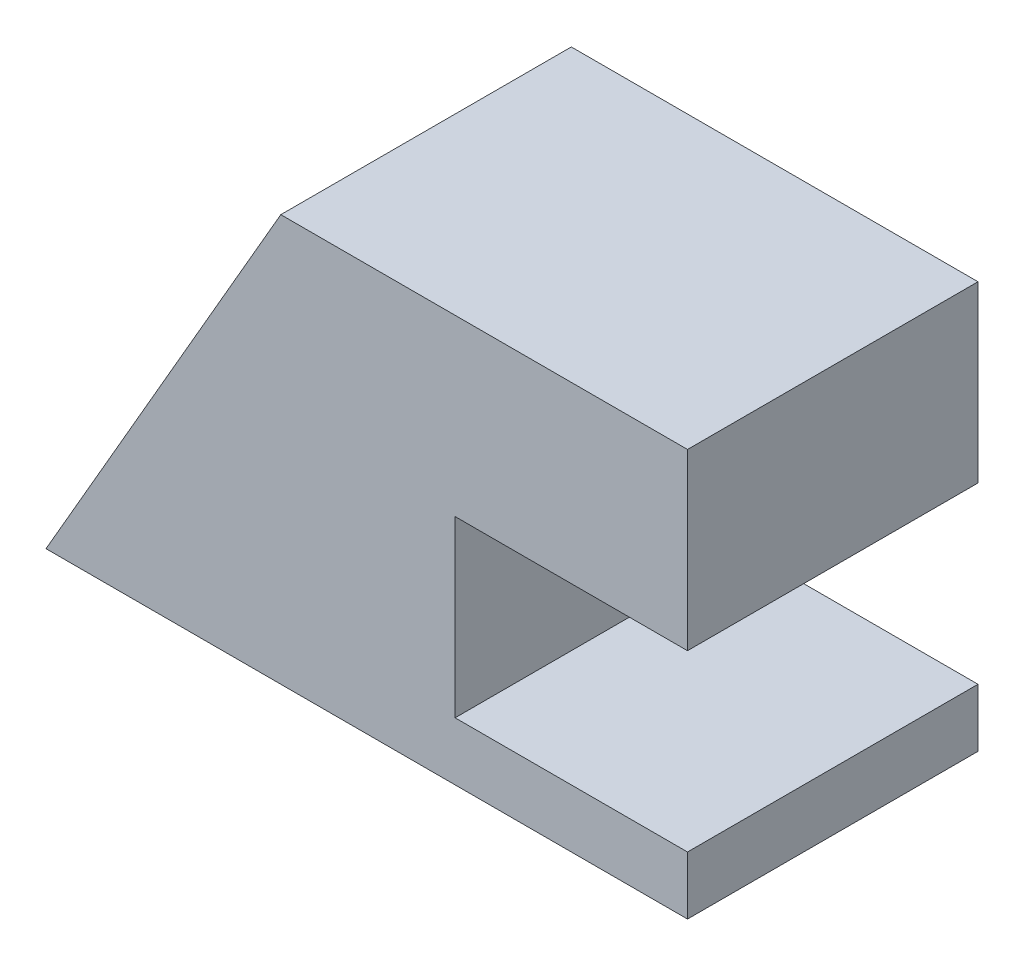
ISO-10303-21;
HEADER;
FILE_DESCRIPTION(('STEP AP214'),'2;1');
FILE_NAME('part.step','',(''),(''),'','','');
FILE_SCHEMA(('AUTOMOTIVE_DESIGN { 1 0 10303 214 1 1 1 1 }'));
ENDSEC;
DATA;
#1=APPLICATION_CONTEXT('core data for automotive mechanical design processes');
#2=APPLICATION_PROTOCOL_DEFINITION('international standard','automotive_design',2000,#1);
#3=PRODUCT_CONTEXT('',#1,'mechanical');
#4=PRODUCT('Part','Part','',(#3));
#5=PRODUCT_RELATED_PRODUCT_CATEGORY('part','',(#4));
#6=PRODUCT_DEFINITION_FORMATION('','',#4);
#7=PRODUCT_DEFINITION_CONTEXT('part definition',#1,'design');
#8=PRODUCT_DEFINITION('design','',#6,#7);
#9=PRODUCT_DEFINITION_SHAPE('','',#8);
#10=(LENGTH_UNIT() NAMED_UNIT(*) SI_UNIT(.MILLI.,.METRE.));
#11=(NAMED_UNIT(*) PLANE_ANGLE_UNIT() SI_UNIT($,.RADIAN.));
#12=(NAMED_UNIT(*) SI_UNIT($,.STERADIAN.) SOLID_ANGLE_UNIT());
#13=UNCERTAINTY_MEASURE_WITH_UNIT(LENGTH_MEASURE(1.E-05),#10,'distance_accuracy_value','');
#14=(GEOMETRIC_REPRESENTATION_CONTEXT(3) GLOBAL_UNCERTAINTY_ASSIGNED_CONTEXT((#13)) GLOBAL_UNIT_ASSIGNED_CONTEXT((#10,
#11,#12)) REPRESENTATION_CONTEXT('',''));
#15=CARTESIAN_POINT('',(0.,0.,0.));
#16=DIRECTION('',(0.,0.,1.));
#17=DIRECTION('',(1.,0.,0.));
#18=AXIS2_PLACEMENT_3D('',#15,#16,#17);
#19=CARTESIAN_POINT('',(11.0414518843274,4.,5.));
#20=DIRECTION('',(-1.,0.,0.));
#21=DIRECTION('',(0.,0.,1.));
#22=AXIS2_PLACEMENT_3D('',#19,#20,#21);
#23=PLANE('',#22);
#24=DIRECTION('',(0.,1.,0.));
#25=VECTOR('',#24,1.);
#26=CARTESIAN_POINT('',(11.0414518843274,4.,0.));
#27=LINE('',#26,#25);
#28=CARTESIAN_POINT('',(11.0414518843274,4.,0.));
#29=VERTEX_POINT('',#28);
#30=CARTESIAN_POINT('',(11.0414518843274,7.,0.));
#31=VERTEX_POINT('',#30);
#32=EDGE_CURVE('E145',#29,#31,#27,.T.);
#33=ORIENTED_EDGE('',*,*,#32,.T.);
#34=DIRECTION('',(0.,0.,-1.));
#35=VECTOR('',#34,1.);
#36=CARTESIAN_POINT('',(11.0414518843274,7.,5.));
#37=LINE('',#36,#35);
#38=CARTESIAN_POINT('',(11.0414518843274,7.,5.));
#39=VERTEX_POINT('',#38);
#40=EDGE_CURVE('E11',#39,#31,#37,.T.);
#41=ORIENTED_EDGE('',*,*,#40,.F.);
#42=DIRECTION('',(0.,1.,0.));
#43=VECTOR('',#42,1.);
#44=CARTESIAN_POINT('',(11.0414518843274,4.,5.));
#45=LINE('',#44,#43);
#46=CARTESIAN_POINT('',(11.0414518843274,4.,5.));
#47=VERTEX_POINT('',#46);
#48=EDGE_CURVE('E167',#47,#39,#45,.T.);
#49=ORIENTED_EDGE('',*,*,#48,.F.);
#50=DIRECTION('',(0.,0.,-1.));
#51=VECTOR('',#50,1.);
#52=CARTESIAN_POINT('',(11.0414518843274,4.,5.));
#53=LINE('',#52,#51);
#54=EDGE_CURVE('E141',#47,#29,#53,.T.);
#55=ORIENTED_EDGE('',*,*,#54,.T.);
#56=EDGE_LOOP('',(#33,#41,#49,#55));
#57=FACE_BOUND('',#56,.T.);
#58=ADVANCED_FACE('F44',(#57),#23,.F.);
#59=CARTESIAN_POINT('',(11.0414518843274,7.,5.));
#60=DIRECTION('',(0.,-1.,0.));
#61=DIRECTION('',(0.,0.,-1.));
#62=AXIS2_PLACEMENT_3D('',#59,#60,#61);
#63=PLANE('',#62);
#64=DIRECTION('',(-1.,0.,0.));
#65=VECTOR('',#64,1.);
#66=CARTESIAN_POINT('',(11.0414518843274,7.,0.));
#67=LINE('',#66,#65);
#68=CARTESIAN_POINT('',(4.04145188432742,7.,0.));
#69=VERTEX_POINT('',#68);
#70=EDGE_CURVE('E149',#31,#69,#67,.T.);
#71=ORIENTED_EDGE('',*,*,#70,.T.);
#72=DIRECTION('',(0.,0.,-1.));
#73=VECTOR('',#72,1.);
#74=CARTESIAN_POINT('',(4.04145188432742,7.,5.));
#75=LINE('',#74,#73);
#76=CARTESIAN_POINT('',(4.04145188432742,7.,5.));
#77=VERTEX_POINT('',#76);
#78=EDGE_CURVE('E53',#77,#69,#75,.T.);
#79=ORIENTED_EDGE('',*,*,#78,.F.);
#80=DIRECTION('',(-1.,0.,0.));
#81=VECTOR('',#80,1.);
#82=CARTESIAN_POINT('',(11.0414518843274,7.,5.));
#83=LINE('',#82,#81);
#84=EDGE_CURVE('E104',#39,#77,#83,.T.);
#85=ORIENTED_EDGE('',*,*,#84,.F.);
#86=ORIENTED_EDGE('',*,*,#40,.T.);
#87=EDGE_LOOP('',(#71,#79,#85,#86));
#88=FACE_BOUND('',#87,.T.);
#89=ADVANCED_FACE('F213',(#88),#63,.F.);
#90=CARTESIAN_POINT('',(4.04145188432742,7.,5.));
#91=DIRECTION('',(0.866025403784436,-0.500000000000004,0.));
#92=DIRECTION('',(0.500000000000004,0.866025403784436,0.));
#93=AXIS2_PLACEMENT_3D('',#90,#91,#92);
#94=PLANE('',#93);
#95=DIRECTION('',(-0.500000000000004,-0.866025403784436,0.));
#96=VECTOR('',#95,1.);
#97=CARTESIAN_POINT('',(4.04145188432742,7.,0.));
#98=LINE('',#97,#96);
#99=CARTESIAN_POINT('',(0.,0.,0.));
#100=VERTEX_POINT('',#99);
#101=EDGE_CURVE('E152',#69,#100,#98,.T.);
#102=ORIENTED_EDGE('',*,*,#101,.T.);
#103=DIRECTION('',(0.,0.,-1.));
#104=VECTOR('',#103,1.);
#105=CARTESIAN_POINT('',(0.,0.,5.));
#106=LINE('',#105,#104);
#107=CARTESIAN_POINT('',(0.,0.,5.));
#108=VERTEX_POINT('',#107);
#109=EDGE_CURVE('E178',#108,#100,#106,.T.);
#110=ORIENTED_EDGE('',*,*,#109,.F.);
#111=DIRECTION('',(-0.500000000000004,-0.866025403784436,0.));
#112=VECTOR('',#111,1.);
#113=CARTESIAN_POINT('',(4.04145188432742,7.,5.));
#114=LINE('',#113,#112);
#115=EDGE_CURVE('E188',#77,#108,#114,.T.);
#116=ORIENTED_EDGE('',*,*,#115,.F.);
#117=ORIENTED_EDGE('',*,*,#78,.T.);
#118=EDGE_LOOP('',(#102,#110,#116,#117));
#119=FACE_BOUND('',#118,.T.);
#120=ADVANCED_FACE('F186',(#119),#94,.F.);
#121=CARTESIAN_POINT('',(0.,0.,5.));
#122=DIRECTION('',(0.,1.,0.));
#123=DIRECTION('',(-1.,0.,0.));
#124=AXIS2_PLACEMENT_3D('',#121,#122,#123);
#125=PLANE('',#124);
#126=DIRECTION('',(1.,0.,0.));
#127=VECTOR('',#126,1.);
#128=CARTESIAN_POINT('',(0.,0.,0.));
#129=LINE('',#128,#127);
#130=CARTESIAN_POINT('',(11.0414518843274,0.,0.));
#131=VERTEX_POINT('',#130);
#132=EDGE_CURVE('E155',#100,#131,#129,.T.);
#133=ORIENTED_EDGE('',*,*,#132,.T.);
#134=DIRECTION('',(0.,0.,-1.));
#135=VECTOR('',#134,1.);
#136=CARTESIAN_POINT('',(11.0414518843274,0.,5.));
#137=LINE('',#136,#135);
#138=CARTESIAN_POINT('',(11.0414518843274,0.,5.));
#139=VERTEX_POINT('',#138);
#140=EDGE_CURVE('E174',#139,#131,#137,.T.);
#141=ORIENTED_EDGE('',*,*,#140,.F.);
#142=DIRECTION('',(1.,0.,0.));
#143=VECTOR('',#142,1.);
#144=CARTESIAN_POINT('',(0.,0.,5.));
#145=LINE('',#144,#143);
#146=EDGE_CURVE('E201',#108,#139,#145,.T.);
#147=ORIENTED_EDGE('',*,*,#146,.F.);
#148=ORIENTED_EDGE('',*,*,#109,.T.);
#149=EDGE_LOOP('',(#133,#141,#147,#148));
#150=FACE_BOUND('',#149,.T.);
#151=ADVANCED_FACE('F196',(#150),#125,.F.);
#152=CARTESIAN_POINT('',(11.0414518843274,0.,5.));
#153=DIRECTION('',(-1.,0.,0.));
#154=DIRECTION('',(0.,0.,1.));
#155=AXIS2_PLACEMENT_3D('',#152,#153,#154);
#156=PLANE('',#155);
#157=DIRECTION('',(0.,1.,0.));
#158=VECTOR('',#157,1.);
#159=CARTESIAN_POINT('',(11.0414518843274,0.,0.));
#160=LINE('',#159,#158);
#161=CARTESIAN_POINT('',(11.0414518843274,1.,0.));
#162=VERTEX_POINT('',#161);
#163=EDGE_CURVE('E158',#131,#162,#160,.T.);
#164=ORIENTED_EDGE('',*,*,#163,.T.);
#165=DIRECTION('',(0.,0.,-1.));
#166=VECTOR('',#165,1.);
#167=CARTESIAN_POINT('',(11.0414518843274,1.,5.));
#168=LINE('',#167,#166);
#169=CARTESIAN_POINT('',(11.0414518843274,1.,5.));
#170=VERTEX_POINT('',#169);
#171=EDGE_CURVE('E134',#170,#162,#168,.T.);
#172=ORIENTED_EDGE('',*,*,#171,.F.);
#173=DIRECTION('',(0.,1.,0.));
#174=VECTOR('',#173,1.);
#175=CARTESIAN_POINT('',(11.0414518843274,0.,5.));
#176=LINE('',#175,#174);
#177=EDGE_CURVE('E123',#139,#170,#176,.T.);
#178=ORIENTED_EDGE('',*,*,#177,.F.);
#179=ORIENTED_EDGE('',*,*,#140,.T.);
#180=EDGE_LOOP('',(#164,#172,#178,#179));
#181=FACE_BOUND('',#180,.T.);
#182=ADVANCED_FACE('F199',(#181),#156,.F.);
#183=CARTESIAN_POINT('',(11.0414518843274,1.,5.));
#184=DIRECTION('',(0.,-1.,0.));
#185=DIRECTION('',(0.,0.,-1.));
#186=AXIS2_PLACEMENT_3D('',#183,#184,#185);
#187=PLANE('',#186);
#188=DIRECTION('',(-1.,0.,0.));
#189=VECTOR('',#188,1.);
#190=CARTESIAN_POINT('',(11.0414518843274,1.,0.));
#191=LINE('',#190,#189);
#192=CARTESIAN_POINT('',(7.04145188432743,1.,0.));
#193=VERTEX_POINT('',#192);
#194=EDGE_CURVE('E132',#162,#193,#191,.T.);
#195=ORIENTED_EDGE('',*,*,#194,.T.);
#196=DIRECTION('',(0.,0.,-1.));
#197=VECTOR('',#196,1.);
#198=CARTESIAN_POINT('',(7.04145188432743,1.,5.));
#199=LINE('',#198,#197);
#200=CARTESIAN_POINT('',(7.04145188432743,1.,5.));
#201=VERTEX_POINT('',#200);
#202=EDGE_CURVE('E129',#201,#193,#199,.T.);
#203=ORIENTED_EDGE('',*,*,#202,.F.);
#204=DIRECTION('',(-1.,0.,0.));
#205=VECTOR('',#204,1.);
#206=CARTESIAN_POINT('',(11.0414518843274,1.,5.));
#207=LINE('',#206,#205);
#208=EDGE_CURVE('E117',#170,#201,#207,.T.);
#209=ORIENTED_EDGE('',*,*,#208,.F.);
#210=ORIENTED_EDGE('',*,*,#171,.T.);
#211=EDGE_LOOP('',(#195,#203,#209,#210));
#212=FACE_BOUND('',#211,.T.);
#213=ADVANCED_FACE('F130',(#212),#187,.F.);
#214=CARTESIAN_POINT('',(7.04145188432743,1.,5.));
#215=DIRECTION('',(-1.,0.,0.));
#216=DIRECTION('',(0.,-1.,0.));
#217=AXIS2_PLACEMENT_3D('',#214,#215,#216);
#218=PLANE('',#217);
#219=DIRECTION('',(0.,1.,0.));
#220=VECTOR('',#219,1.);
#221=CARTESIAN_POINT('',(7.04145188432743,1.,0.));
#222=LINE('',#221,#220);
#223=CARTESIAN_POINT('',(7.04145188432742,4.,0.));
#224=VERTEX_POINT('',#223);
#225=EDGE_CURVE('E90',#193,#224,#222,.T.);
#226=ORIENTED_EDGE('',*,*,#225,.T.);
#227=DIRECTION('',(0.,0.,-1.));
#228=VECTOR('',#227,1.);
#229=CARTESIAN_POINT('',(7.04145188432742,4.,5.));
#230=LINE('',#229,#228);
#231=CARTESIAN_POINT('',(7.04145188432742,4.,5.));
#232=VERTEX_POINT('',#231);
#233=EDGE_CURVE('E135',#232,#224,#230,.T.);
#234=ORIENTED_EDGE('',*,*,#233,.F.);
#235=DIRECTION('',(0.,1.,0.));
#236=VECTOR('',#235,1.);
#237=CARTESIAN_POINT('',(7.04145188432743,1.,5.));
#238=LINE('',#237,#236);
#239=EDGE_CURVE('E121',#201,#232,#238,.T.);
#240=ORIENTED_EDGE('',*,*,#239,.F.);
#241=ORIENTED_EDGE('',*,*,#202,.T.);
#242=EDGE_LOOP('',(#226,#234,#240,#241));
#243=FACE_BOUND('',#242,.T.);
#244=ADVANCED_FACE('F137',(#243),#218,.F.);
#245=CARTESIAN_POINT('',(7.04145188432742,4.,5.));
#246=DIRECTION('',(0.,1.,0.));
#247=DIRECTION('',(0.,0.,1.));
#248=AXIS2_PLACEMENT_3D('',#245,#246,#247);
#249=PLANE('',#248);
#250=DIRECTION('',(1.,0.,0.));
#251=VECTOR('',#250,1.);
#252=CARTESIAN_POINT('',(7.04145188432742,4.,0.));
#253=LINE('',#252,#251);
#254=EDGE_CURVE('E96',#224,#29,#253,.T.);
#255=ORIENTED_EDGE('',*,*,#254,.T.);
#256=ORIENTED_EDGE('',*,*,#54,.F.);
#257=DIRECTION('',(1.,0.,0.));
#258=VECTOR('',#257,1.);
#259=CARTESIAN_POINT('',(7.04145188432742,4.,5.));
#260=LINE('',#259,#258);
#261=EDGE_CURVE('E61',#232,#47,#260,.T.);
#262=ORIENTED_EDGE('',*,*,#261,.F.);
#263=ORIENTED_EDGE('',*,*,#233,.T.);
#264=EDGE_LOOP('',(#255,#256,#262,#263));
#265=FACE_BOUND('',#264,.T.);
#266=ADVANCED_FACE('F229',(#265),#249,.F.);
#267=CARTESIAN_POINT('',(0.,0.,5.));
#268=DIRECTION('',(0.,0.,1.));
#269=DIRECTION('',(1.,0.,0.));
#270=AXIS2_PLACEMENT_3D('',#267,#268,#269);
#271=PLANE('',#270);
#272=ORIENTED_EDGE('',*,*,#48,.T.);
#273=ORIENTED_EDGE('',*,*,#84,.T.);
#274=ORIENTED_EDGE('',*,*,#115,.T.);
#275=ORIENTED_EDGE('',*,*,#146,.T.);
#276=ORIENTED_EDGE('',*,*,#177,.T.);
#277=ORIENTED_EDGE('',*,*,#208,.T.);
#278=ORIENTED_EDGE('',*,*,#239,.T.);
#279=ORIENTED_EDGE('',*,*,#261,.T.);
#280=EDGE_LOOP('',(#272,#273,#274,#275,#276,#277,#278,#279));
#281=FACE_BOUND('',#280,.T.);
#282=ADVANCED_FACE('F119',(#281),#271,.T.);
#283=CARTESIAN_POINT('',(0.,0.,0.));
#284=DIRECTION('',(0.,0.,1.));
#285=DIRECTION('',(1.,0.,0.));
#286=AXIS2_PLACEMENT_3D('',#283,#284,#285);
#287=PLANE('',#286);
#288=ORIENTED_EDGE('',*,*,#32,.F.);
#289=ORIENTED_EDGE('',*,*,#254,.F.);
#290=ORIENTED_EDGE('',*,*,#225,.F.);
#291=ORIENTED_EDGE('',*,*,#194,.F.);
#292=ORIENTED_EDGE('',*,*,#163,.F.);
#293=ORIENTED_EDGE('',*,*,#132,.F.);
#294=ORIENTED_EDGE('',*,*,#101,.F.);
#295=ORIENTED_EDGE('',*,*,#70,.F.);
#296=EDGE_LOOP('',(#288,#289,#290,#291,#292,#293,#294,#295));
#297=FACE_BOUND('',#296,.T.);
#298=ADVANCED_FACE('F192',(#297),#287,.F.);
#299=CLOSED_SHELL('',(#58,#89,#120,#151,#182,#213,#244,#266,#282,#298));
#300=MANIFOLD_SOLID_BREP('B2',#299);
#301=ADVANCED_BREP_SHAPE_REPRESENTATION('',(#18,#300),#14);
#302=SHAPE_DEFINITION_REPRESENTATION(#9,#301);
ENDSEC;
END-ISO-10303-21;
